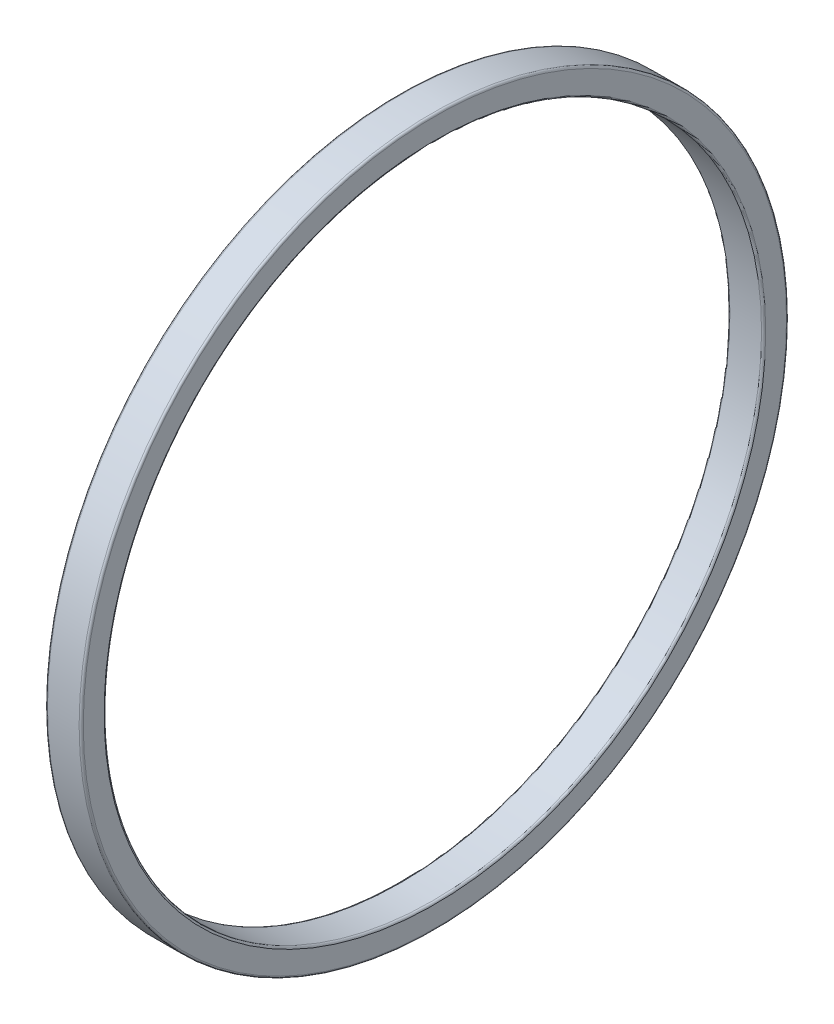
ISO-10303-21;
HEADER;
FILE_DESCRIPTION(('STEP AP214'),'2;1');
FILE_NAME('part.step','',(''),(''),'','','');
FILE_SCHEMA(('AUTOMOTIVE_DESIGN { 1 0 10303 214 1 1 1 1 }'));
ENDSEC;
DATA;
#1=APPLICATION_CONTEXT('core data for automotive mechanical design processes');
#2=APPLICATION_PROTOCOL_DEFINITION('international standard','automotive_design',2000,#1);
#3=PRODUCT_CONTEXT('',#1,'mechanical');
#4=PRODUCT('Part','Part','',(#3));
#5=PRODUCT_RELATED_PRODUCT_CATEGORY('part','',(#4));
#6=PRODUCT_DEFINITION_FORMATION('','',#4);
#7=PRODUCT_DEFINITION_CONTEXT('part definition',#1,'design');
#8=PRODUCT_DEFINITION('design','',#6,#7);
#9=PRODUCT_DEFINITION_SHAPE('','',#8);
#10=(LENGTH_UNIT() NAMED_UNIT(*) SI_UNIT(.MILLI.,.METRE.));
#11=(NAMED_UNIT(*) PLANE_ANGLE_UNIT() SI_UNIT($,.RADIAN.));
#12=(NAMED_UNIT(*) SI_UNIT($,.STERADIAN.) SOLID_ANGLE_UNIT());
#13=UNCERTAINTY_MEASURE_WITH_UNIT(LENGTH_MEASURE(1.E-05),#10,'distance_accuracy_value','');
#14=(GEOMETRIC_REPRESENTATION_CONTEXT(3) GLOBAL_UNCERTAINTY_ASSIGNED_CONTEXT((#13)) GLOBAL_UNIT_ASSIGNED_CONTEXT((#10,
#11,#12)) REPRESENTATION_CONTEXT('',''));
#15=CARTESIAN_POINT('',(0.,0.,0.));
#16=DIRECTION('',(0.,0.,1.));
#17=DIRECTION('',(1.,0.,0.));
#18=AXIS2_PLACEMENT_3D('',#15,#16,#17);
#19=CARTESIAN_POINT('',(2.15,0.,0.));
#20=DIRECTION('',(1.,0.,0.));
#21=DIRECTION('',(0.,0.,-1.));
#22=AXIS2_PLACEMENT_3D('',#19,#20,#21);
#23=PLANE('',#22);
#24=CARTESIAN_POINT('',(2.15,0.,0.));
#25=DIRECTION('',(1.,0.,0.));
#26=DIRECTION('',(0.,0.,-1.));
#27=AXIS2_PLACEMENT_3D('',#24,#25,#26);
#28=CIRCLE('',#27,42.25);
#29=CARTESIAN_POINT('',(2.15,0.,-42.25));
#30=VERTEX_POINT('',#29);
#31=EDGE_CURVE('E42',#30,#30,#28,.T.);
#32=ORIENTED_EDGE('',*,*,#31,.T.);
#33=EDGE_LOOP('',(#32));
#34=FACE_BOUND('',#33,.T.);
#35=CARTESIAN_POINT('',(2.15,0.,0.));
#36=DIRECTION('',(1.,0.,0.));
#37=DIRECTION('',(0.,0.,-1.));
#38=AXIS2_PLACEMENT_3D('',#35,#36,#37);
#39=CIRCLE('',#38,39.75);
#40=CARTESIAN_POINT('',(2.15,0.,-39.75));
#41=VERTEX_POINT('',#40);
#42=EDGE_CURVE('E46',#41,#41,#39,.F.);
#43=ORIENTED_EDGE('',*,*,#42,.T.);
#44=EDGE_LOOP('',(#43));
#45=FACE_BOUND('',#44,.T.);
#46=ADVANCED_FACE('F31',(#34,#45),#23,.T.);
#47=CARTESIAN_POINT('',(-2.15,0.,0.));
#48=DIRECTION('',(1.,0.,0.));
#49=DIRECTION('',(0.,0.,-1.));
#50=AXIS2_PLACEMENT_3D('',#47,#48,#49);
#51=PLANE('',#50);
#52=CARTESIAN_POINT('',(-2.15,0.,0.));
#53=DIRECTION('',(1.,0.,0.));
#54=DIRECTION('',(0.,0.,-1.));
#55=AXIS2_PLACEMENT_3D('',#52,#53,#54);
#56=CIRCLE('',#55,42.25);
#57=CARTESIAN_POINT('',(-2.15,0.,-42.25));
#58=VERTEX_POINT('',#57);
#59=EDGE_CURVE('E51',#58,#58,#56,.F.);
#60=ORIENTED_EDGE('',*,*,#59,.T.);
#61=EDGE_LOOP('',(#60));
#62=FACE_BOUND('',#61,.T.);
#63=CARTESIAN_POINT('',(-2.15,0.,0.));
#64=DIRECTION('',(1.,0.,0.));
#65=DIRECTION('',(0.,0.,-1.));
#66=AXIS2_PLACEMENT_3D('',#63,#64,#65);
#67=CIRCLE('',#66,39.75);
#68=CARTESIAN_POINT('',(-2.15,0.,-39.75));
#69=VERTEX_POINT('',#68);
#70=EDGE_CURVE('E54',#69,#69,#67,.T.);
#71=ORIENTED_EDGE('',*,*,#70,.T.);
#72=EDGE_LOOP('',(#71));
#73=FACE_BOUND('',#72,.T.);
#74=ADVANCED_FACE('F76',(#62,#73),#51,.F.);
#75=CARTESIAN_POINT('',(2.15,0.,0.));
#76=DIRECTION('',(-1.,0.,0.));
#77=DIRECTION('',(0.,0.,1.));
#78=AXIS2_PLACEMENT_3D('',#75,#76,#77);
#79=CYLINDRICAL_SURFACE('',#78,42.5);
#80=CARTESIAN_POINT('',(-1.9,0.,0.));
#81=DIRECTION('',(1.,0.,0.));
#82=DIRECTION('',(0.,0.,-1.));
#83=AXIS2_PLACEMENT_3D('',#80,#81,#82);
#84=CIRCLE('',#83,42.5);
#85=CARTESIAN_POINT('',(-1.9,0.,42.5));
#86=VERTEX_POINT('',#85);
#87=EDGE_CURVE('E57',#86,#86,#84,.T.);
#88=CARTESIAN_POINT('',(1.9,0.,0.));
#89=DIRECTION('',(1.,0.,0.));
#90=DIRECTION('',(0.,0.,-1.));
#91=AXIS2_PLACEMENT_3D('',#88,#89,#90);
#92=CIRCLE('',#91,42.5);
#93=CARTESIAN_POINT('',(1.9,0.,42.5));
#94=VERTEX_POINT('',#93);
#95=EDGE_CURVE('E60',#94,#94,#92,.F.);
#96=CARTESIAN_POINT('',(-1.9,0.,42.5));
#97=CARTESIAN_POINT('',(-1.86041666666667,0.,42.5));
#98=CARTESIAN_POINT('',(-1.82083333333333,0.,42.5));
#99=CARTESIAN_POINT('',(-1.74166666666667,0.,42.5));
#100=CARTESIAN_POINT('',(-1.70208333333333,0.,42.5));
#101=CARTESIAN_POINT('',(-1.62291666666667,0.,42.5));
#102=CARTESIAN_POINT('',(-1.58333333333333,0.,42.5));
#103=CARTESIAN_POINT('',(-1.50416666666667,0.,42.5));
#104=CARTESIAN_POINT('',(-1.46458333333333,0.,42.5));
#105=CARTESIAN_POINT('',(-1.38541666666667,0.,42.5));
#106=CARTESIAN_POINT('',(-1.34583333333333,0.,42.5));
#107=CARTESIAN_POINT('',(-1.26666666666667,0.,42.5));
#108=CARTESIAN_POINT('',(-1.22708333333333,0.,42.5));
#109=CARTESIAN_POINT('',(-1.14791666666667,0.,42.5));
#110=CARTESIAN_POINT('',(-1.10833333333333,0.,42.5));
#111=CARTESIAN_POINT('',(-1.02916666666667,0.,42.5));
#112=CARTESIAN_POINT('',(-0.989583333333334,0.,42.5));
#113=CARTESIAN_POINT('',(-0.910416666666667,0.,42.5));
#114=CARTESIAN_POINT('',(-0.870833333333334,0.,42.5));
#115=CARTESIAN_POINT('',(-0.791666666666668,0.,42.5));
#116=CARTESIAN_POINT('',(-0.752083333333334,0.,42.5));
#117=CARTESIAN_POINT('',(-0.672916666666667,0.,42.5));
#118=CARTESIAN_POINT('',(-0.633333333333334,0.,42.5));
#119=CARTESIAN_POINT('',(-0.554166666666667,0.,42.5));
#120=CARTESIAN_POINT('',(-0.514583333333334,0.,42.5));
#121=CARTESIAN_POINT('',(-0.435416666666667,0.,42.5));
#122=CARTESIAN_POINT('',(-0.395833333333334,0.,42.5));
#123=CARTESIAN_POINT('',(-0.316666666666667,0.,42.5));
#124=CARTESIAN_POINT('',(-0.277083333333334,0.,42.5));
#125=CARTESIAN_POINT('',(-0.197916666666667,0.,42.5));
#126=CARTESIAN_POINT('',(-0.158333333333334,0.,42.5));
#127=CARTESIAN_POINT('',(-0.0791666666666671,0.,42.5));
#128=CARTESIAN_POINT('',(-0.0395833333333337,0.,42.5));
#129=CARTESIAN_POINT('',(0.0395833333333329,0.,42.5));
#130=CARTESIAN_POINT('',(0.0791666666666662,0.,42.5));
#131=CARTESIAN_POINT('',(0.158333333333333,0.,42.5));
#132=CARTESIAN_POINT('',(0.197916666666666,0.,42.5));
#133=CARTESIAN_POINT('',(0.277083333333333,0.,42.5));
#134=CARTESIAN_POINT('',(0.316666666666666,0.,42.5));
#135=CARTESIAN_POINT('',(0.395833333333333,0.,42.5));
#136=CARTESIAN_POINT('',(0.435416666666666,0.,42.5));
#137=CARTESIAN_POINT('',(0.514583333333333,0.,42.5));
#138=CARTESIAN_POINT('',(0.554166666666666,0.,42.5));
#139=CARTESIAN_POINT('',(0.633333333333333,0.,42.5));
#140=CARTESIAN_POINT('',(0.672916666666666,0.,42.5));
#141=CARTESIAN_POINT('',(0.752083333333333,0.,42.5));
#142=CARTESIAN_POINT('',(0.791666666666666,0.,42.5));
#143=CARTESIAN_POINT('',(0.870833333333333,0.,42.5));
#144=CARTESIAN_POINT('',(0.910416666666666,0.,42.5));
#145=CARTESIAN_POINT('',(0.989583333333333,0.,42.5));
#146=CARTESIAN_POINT('',(1.02916666666667,0.,42.5));
#147=CARTESIAN_POINT('',(1.10833333333333,0.,42.5));
#148=CARTESIAN_POINT('',(1.14791666666667,0.,42.5));
#149=CARTESIAN_POINT('',(1.22708333333333,0.,42.5));
#150=CARTESIAN_POINT('',(1.26666666666667,0.,42.5));
#151=CARTESIAN_POINT('',(1.34583333333333,0.,42.5));
#152=CARTESIAN_POINT('',(1.38541666666667,0.,42.5));
#153=CARTESIAN_POINT('',(1.46458333333333,0.,42.5));
#154=CARTESIAN_POINT('',(1.50416666666667,0.,42.5));
#155=CARTESIAN_POINT('',(1.58333333333333,0.,42.5));
#156=CARTESIAN_POINT('',(1.62291666666667,0.,42.5));
#157=CARTESIAN_POINT('',(1.70208333333333,0.,42.5));
#158=CARTESIAN_POINT('',(1.74166666666667,0.,42.5));
#159=CARTESIAN_POINT('',(1.82083333333333,0.,42.5));
#160=CARTESIAN_POINT('',(1.86041666666667,0.,42.5));
#161=CARTESIAN_POINT('',(1.9,0.,42.5));
#162=B_SPLINE_CURVE_WITH_KNOTS('',3,(#96,#97,#98,#99,#100,#101,#102,#103,#104,#105,#106,#107,
#108,#109,#110,#111,#112,#113,#114,#115,#116,#117,#118,#119,#120,#121,#122,#123,#124,#125,#126,
#127,#128,#129,#130,#131,#132,#133,#134,#135,#136,#137,#138,#139,#140,#141,#142,#143,#144,#145,
#146,#147,#148,#149,#150,#151,#152,#153,#154,#155,#156,#157,#158,#159,#160,#161),.UNSPECIFIED.,
.F.,.F.,(4,2,2,2,2,2,2,2,2,2,2,2,2,2,2,2,2,2,2,2,2,2,2,2,2,2,2,2,2,2,2,2,4),(0.,0.11875,
0.237499999999999,0.35625,0.475,0.59375,0.7125,0.83125,0.95,1.06875,1.1875,1.30625,1.425,
1.54375,1.6625,1.78125,1.9,2.01875,2.1375,2.25625,2.375,2.49375,2.6125,2.73125,2.85,2.96875,
3.0875,3.20625,3.325,3.44375,3.5625,3.68125,3.8),.UNSPECIFIED.);
#163=EDGE_CURVE('BSEAM64',#86,#94,#162,.T.);
#164=ORIENTED_EDGE('',*,*,#87,.T.);
#165=ORIENTED_EDGE('',*,*,#95,.T.);
#166=ORIENTED_EDGE('',*,*,#163,.T.);
#167=ORIENTED_EDGE('',*,*,#163,.F.);
#168=EDGE_LOOP('',(#164,#166,#165,#167));
#169=FACE_BOUND('',#168,.T.);
#170=ADVANCED_FACE('F64',(#169),#79,.T.);
#171=CARTESIAN_POINT('',(2.15,0.,0.));
#172=DIRECTION('',(-1.,0.,0.));
#173=DIRECTION('',(0.,0.,1.));
#174=AXIS2_PLACEMENT_3D('',#171,#172,#173);
#175=CYLINDRICAL_SURFACE('',#174,39.5);
#176=CARTESIAN_POINT('',(-1.9,0.,0.));
#177=DIRECTION('',(1.,0.,0.));
#178=DIRECTION('',(0.,0.,-1.));
#179=AXIS2_PLACEMENT_3D('',#176,#177,#178);
#180=CIRCLE('',#179,39.5);
#181=CARTESIAN_POINT('',(-1.9,0.,39.5));
#182=VERTEX_POINT('',#181);
#183=EDGE_CURVE('E10',#182,#182,#180,.F.);
#184=CARTESIAN_POINT('',(1.9,0.,0.));
#185=DIRECTION('',(1.,0.,0.));
#186=DIRECTION('',(0.,0.,-1.));
#187=AXIS2_PLACEMENT_3D('',#184,#185,#186);
#188=CIRCLE('',#187,39.5);
#189=CARTESIAN_POINT('',(1.9,0.,39.5));
#190=VERTEX_POINT('',#189);
#191=EDGE_CURVE('E38',#190,#190,#188,.T.);
#192=CARTESIAN_POINT('',(-1.9,0.,39.5));
#193=CARTESIAN_POINT('',(-1.86041666666667,0.,39.5));
#194=CARTESIAN_POINT('',(-1.82083333333333,0.,39.5));
#195=CARTESIAN_POINT('',(-1.74166666666667,0.,39.5));
#196=CARTESIAN_POINT('',(-1.70208333333333,0.,39.5));
#197=CARTESIAN_POINT('',(-1.62291666666667,0.,39.5));
#198=CARTESIAN_POINT('',(-1.58333333333333,0.,39.5));
#199=CARTESIAN_POINT('',(-1.50416666666667,0.,39.5));
#200=CARTESIAN_POINT('',(-1.46458333333333,0.,39.5));
#201=CARTESIAN_POINT('',(-1.38541666666667,0.,39.5));
#202=CARTESIAN_POINT('',(-1.34583333333333,0.,39.5));
#203=CARTESIAN_POINT('',(-1.26666666666667,0.,39.5));
#204=CARTESIAN_POINT('',(-1.22708333333333,0.,39.5));
#205=CARTESIAN_POINT('',(-1.14791666666667,0.,39.5));
#206=CARTESIAN_POINT('',(-1.10833333333333,0.,39.5));
#207=CARTESIAN_POINT('',(-1.02916666666667,0.,39.5));
#208=CARTESIAN_POINT('',(-0.989583333333334,0.,39.5));
#209=CARTESIAN_POINT('',(-0.910416666666667,0.,39.5));
#210=CARTESIAN_POINT('',(-0.870833333333334,0.,39.5));
#211=CARTESIAN_POINT('',(-0.791666666666668,0.,39.5));
#212=CARTESIAN_POINT('',(-0.752083333333334,0.,39.5));
#213=CARTESIAN_POINT('',(-0.672916666666667,0.,39.5));
#214=CARTESIAN_POINT('',(-0.633333333333334,0.,39.5));
#215=CARTESIAN_POINT('',(-0.554166666666667,0.,39.5));
#216=CARTESIAN_POINT('',(-0.514583333333334,0.,39.5));
#217=CARTESIAN_POINT('',(-0.435416666666667,0.,39.5));
#218=CARTESIAN_POINT('',(-0.395833333333334,0.,39.5));
#219=CARTESIAN_POINT('',(-0.316666666666667,0.,39.5));
#220=CARTESIAN_POINT('',(-0.277083333333334,0.,39.5));
#221=CARTESIAN_POINT('',(-0.197916666666667,0.,39.5));
#222=CARTESIAN_POINT('',(-0.158333333333334,0.,39.5));
#223=CARTESIAN_POINT('',(-0.0791666666666671,0.,39.5));
#224=CARTESIAN_POINT('',(-0.0395833333333337,0.,39.5));
#225=CARTESIAN_POINT('',(0.0395833333333329,0.,39.5));
#226=CARTESIAN_POINT('',(0.0791666666666662,0.,39.5));
#227=CARTESIAN_POINT('',(0.158333333333333,0.,39.5));
#228=CARTESIAN_POINT('',(0.197916666666666,0.,39.5));
#229=CARTESIAN_POINT('',(0.277083333333333,0.,39.5));
#230=CARTESIAN_POINT('',(0.316666666666666,0.,39.5));
#231=CARTESIAN_POINT('',(0.395833333333333,0.,39.5));
#232=CARTESIAN_POINT('',(0.435416666666666,0.,39.5));
#233=CARTESIAN_POINT('',(0.514583333333333,0.,39.5));
#234=CARTESIAN_POINT('',(0.554166666666666,0.,39.5));
#235=CARTESIAN_POINT('',(0.633333333333333,0.,39.5));
#236=CARTESIAN_POINT('',(0.672916666666666,0.,39.5));
#237=CARTESIAN_POINT('',(0.752083333333333,0.,39.5));
#238=CARTESIAN_POINT('',(0.791666666666666,0.,39.5));
#239=CARTESIAN_POINT('',(0.870833333333333,0.,39.5));
#240=CARTESIAN_POINT('',(0.910416666666666,0.,39.5));
#241=CARTESIAN_POINT('',(0.989583333333333,0.,39.5));
#242=CARTESIAN_POINT('',(1.02916666666667,0.,39.5));
#243=CARTESIAN_POINT('',(1.10833333333333,0.,39.5));
#244=CARTESIAN_POINT('',(1.14791666666667,0.,39.5));
#245=CARTESIAN_POINT('',(1.22708333333333,0.,39.5));
#246=CARTESIAN_POINT('',(1.26666666666667,0.,39.5));
#247=CARTESIAN_POINT('',(1.34583333333333,0.,39.5));
#248=CARTESIAN_POINT('',(1.38541666666667,0.,39.5));
#249=CARTESIAN_POINT('',(1.46458333333333,0.,39.5));
#250=CARTESIAN_POINT('',(1.50416666666667,0.,39.5));
#251=CARTESIAN_POINT('',(1.58333333333333,0.,39.5));
#252=CARTESIAN_POINT('',(1.62291666666667,0.,39.5));
#253=CARTESIAN_POINT('',(1.70208333333333,0.,39.5));
#254=CARTESIAN_POINT('',(1.74166666666667,0.,39.5));
#255=CARTESIAN_POINT('',(1.82083333333333,0.,39.5));
#256=CARTESIAN_POINT('',(1.86041666666667,0.,39.5));
#257=CARTESIAN_POINT('',(1.9,0.,39.5));
#258=B_SPLINE_CURVE_WITH_KNOTS('',3,(#192,#193,#194,#195,#196,#197,#198,#199,#200,#201,#202,
#203,#204,#205,#206,#207,#208,#209,#210,#211,#212,#213,#214,#215,#216,#217,#218,#219,#220,#221,
#222,#223,#224,#225,#226,#227,#228,#229,#230,#231,#232,#233,#234,#235,#236,#237,#238,#239,#240,
#241,#242,#243,#244,#245,#246,#247,#248,#249,#250,#251,#252,#253,#254,#255,#256,#257),
.UNSPECIFIED.,.F.,.F.,(4,2,2,2,2,2,2,2,2,2,2,2,2,2,2,2,2,2,2,2,2,2,2,2,2,2,2,2,2,2,2,2,4),(0.,
0.11875,0.237499999999999,0.35625,0.475,0.59375,0.7125,0.83125,0.95,1.06875,1.1875,1.30625,
1.425,1.54375,1.6625,1.78125,1.9,2.01875,2.1375,2.25625,2.375,2.49375,2.6125,2.73125,2.85,
2.96875,3.0875,3.20625,3.325,3.44375,3.5625,3.68125,3.8),.UNSPECIFIED.);
#259=EDGE_CURVE('BSEAM92',#182,#190,#258,.T.);
#260=ORIENTED_EDGE('',*,*,#183,.T.);
#261=ORIENTED_EDGE('',*,*,#191,.T.);
#262=ORIENTED_EDGE('',*,*,#259,.T.);
#263=ORIENTED_EDGE('',*,*,#259,.F.);
#264=EDGE_LOOP('',(#260,#262,#261,#263));
#265=FACE_BOUND('',#264,.T.);
#266=ADVANCED_FACE('F92',(#265),#175,.F.);
#267=CARTESIAN_POINT('',(-1.9,0.,0.));
#268=DIRECTION('',(1.,0.,0.));
#269=DIRECTION('',(0.,0.,-1.));
#270=AXIS2_PLACEMENT_3D('',#267,#268,#269);
#271=TOROIDAL_SURFACE('',#270,42.25,0.25);
#272=ORIENTED_EDGE('',*,*,#59,.F.);
#273=EDGE_LOOP('',(#272));
#274=FACE_BOUND('',#273,.T.);
#275=ORIENTED_EDGE('',*,*,#87,.F.);
#276=EDGE_LOOP('',(#275));
#277=FACE_BOUND('',#276,.T.);
#278=ADVANCED_FACE('F70',(#274,#277),#271,.T.);
#279=CARTESIAN_POINT('',(1.9,0.,0.));
#280=DIRECTION('',(1.,0.,0.));
#281=DIRECTION('',(0.,0.,-1.));
#282=AXIS2_PLACEMENT_3D('',#279,#280,#281);
#283=TOROIDAL_SURFACE('',#282,42.25,0.25);
#284=ORIENTED_EDGE('',*,*,#95,.F.);
#285=EDGE_LOOP('',(#284));
#286=FACE_BOUND('',#285,.T.);
#287=ORIENTED_EDGE('',*,*,#31,.F.);
#288=EDGE_LOOP('',(#287));
#289=FACE_BOUND('',#288,.T.);
#290=ADVANCED_FACE('F66',(#286,#289),#283,.T.);
#291=CARTESIAN_POINT('',(-1.9,0.,0.));
#292=DIRECTION('',(1.,0.,0.));
#293=DIRECTION('',(0.,0.,-1.));
#294=AXIS2_PLACEMENT_3D('',#291,#292,#293);
#295=TOROIDAL_SURFACE('',#294,39.75,0.25);
#296=ORIENTED_EDGE('',*,*,#183,.F.);
#297=EDGE_LOOP('',(#296));
#298=FACE_BOUND('',#297,.T.);
#299=ORIENTED_EDGE('',*,*,#70,.F.);
#300=EDGE_LOOP('',(#299));
#301=FACE_BOUND('',#300,.T.);
#302=ADVANCED_FACE('F69',(#298,#301),#295,.T.);
#303=CARTESIAN_POINT('',(1.9,0.,0.));
#304=DIRECTION('',(1.,0.,0.));
#305=DIRECTION('',(0.,0.,-1.));
#306=AXIS2_PLACEMENT_3D('',#303,#304,#305);
#307=TOROIDAL_SURFACE('',#306,39.75,0.25);
#308=ORIENTED_EDGE('',*,*,#42,.F.);
#309=EDGE_LOOP('',(#308));
#310=FACE_BOUND('',#309,.T.);
#311=ORIENTED_EDGE('',*,*,#191,.F.);
#312=EDGE_LOOP('',(#311));
#313=FACE_BOUND('',#312,.T.);
#314=ADVANCED_FACE('F33',(#310,#313),#307,.T.);
#315=CLOSED_SHELL('',(#46,#74,#170,#266,#278,#290,#302,#314));
#316=MANIFOLD_SOLID_BREP('B2',#315);
#317=ADVANCED_BREP_SHAPE_REPRESENTATION('',(#18,#316),#14);
#318=SHAPE_DEFINITION_REPRESENTATION(#9,#317);
ENDSEC;
END-ISO-10303-21;
